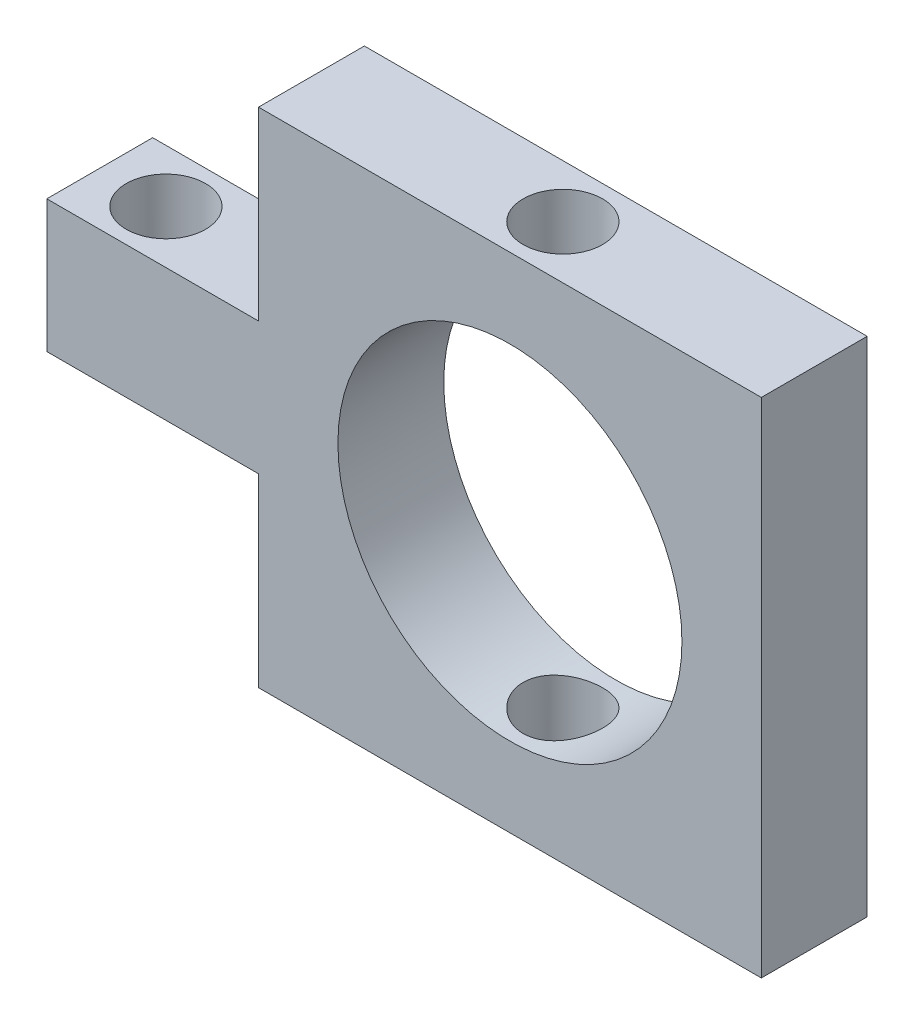
ISO-10303-21;
HEADER;
FILE_DESCRIPTION(('STEP AP214'),'2;1');
FILE_NAME('part.step','',(''),(''),'','','');
FILE_SCHEMA(('AUTOMOTIVE_DESIGN { 1 0 10303 214 1 1 1 1 }'));
ENDSEC;
DATA;
#1=APPLICATION_CONTEXT('core data for automotive mechanical design processes');
#2=APPLICATION_PROTOCOL_DEFINITION('international standard','automotive_design',2000,#1);
#3=PRODUCT_CONTEXT('',#1,'mechanical');
#4=PRODUCT('Part','Part','',(#3));
#5=PRODUCT_RELATED_PRODUCT_CATEGORY('part','',(#4));
#6=PRODUCT_DEFINITION_FORMATION('','',#4);
#7=PRODUCT_DEFINITION_CONTEXT('part definition',#1,'design');
#8=PRODUCT_DEFINITION('design','',#6,#7);
#9=PRODUCT_DEFINITION_SHAPE('','',#8);
#10=(LENGTH_UNIT() NAMED_UNIT(*) SI_UNIT(.MILLI.,.METRE.));
#11=(NAMED_UNIT(*) PLANE_ANGLE_UNIT() SI_UNIT($,.RADIAN.));
#12=(NAMED_UNIT(*) SI_UNIT($,.STERADIAN.) SOLID_ANGLE_UNIT());
#13=UNCERTAINTY_MEASURE_WITH_UNIT(LENGTH_MEASURE(1.E-05),#10,'distance_accuracy_value','');
#14=(GEOMETRIC_REPRESENTATION_CONTEXT(3) GLOBAL_UNCERTAINTY_ASSIGNED_CONTEXT((#13)) GLOBAL_UNIT_ASSIGNED_CONTEXT((#10,
#11,#12)) REPRESENTATION_CONTEXT('',''));
#15=CARTESIAN_POINT('',(0.,0.,0.));
#16=DIRECTION('',(0.,0.,1.));
#17=DIRECTION('',(1.,0.,0.));
#18=AXIS2_PLACEMENT_3D('',#15,#16,#17);
#19=CARTESIAN_POINT('',(-9.5,-9.5,4.));
#20=DIRECTION('',(1.,0.,0.));
#21=DIRECTION('',(0.,0.,-1.));
#22=AXIS2_PLACEMENT_3D('',#19,#20,#21);
#23=PLANE('',#22);
#24=DIRECTION('',(0.,0.,-1.));
#25=VECTOR('',#24,1.);
#26=CARTESIAN_POINT('',(-9.5,2.5,0.));
#27=LINE('',#26,#25);
#28=CARTESIAN_POINT('',(-9.5,2.5,4.));
#29=VERTEX_POINT('',#28);
#30=CARTESIAN_POINT('',(-9.5,2.5,0.));
#31=VERTEX_POINT('',#30);
#32=EDGE_CURVE('E60',#29,#31,#27,.T.);
#33=ORIENTED_EDGE('',*,*,#32,.F.);
#34=DIRECTION('',(0.,-1.,0.));
#35=VECTOR('',#34,1.);
#36=CARTESIAN_POINT('',(-9.5,-9.5,4.));
#37=LINE('',#36,#35);
#38=CARTESIAN_POINT('',(-9.5,9.5,4.));
#39=VERTEX_POINT('',#38);
#40=EDGE_CURVE('E217',#39,#29,#37,.T.);
#41=ORIENTED_EDGE('',*,*,#40,.F.);
#42=DIRECTION('',(0.,0.,-1.));
#43=VECTOR('',#42,1.);
#44=CARTESIAN_POINT('',(-9.5,9.5,4.));
#45=LINE('',#44,#43);
#46=CARTESIAN_POINT('',(-9.5,9.5,0.));
#47=VERTEX_POINT('',#46);
#48=EDGE_CURVE('E53',#39,#47,#45,.T.);
#49=ORIENTED_EDGE('',*,*,#48,.T.);
#50=DIRECTION('',(0.,-1.,0.));
#51=VECTOR('',#50,1.);
#52=CARTESIAN_POINT('',(-9.5,-9.5,0.));
#53=LINE('',#52,#51);
#54=EDGE_CURVE('E216',#47,#31,#53,.T.);
#55=ORIENTED_EDGE('',*,*,#54,.T.);
#56=EDGE_LOOP('',(#33,#41,#49,#55));
#57=FACE_BOUND('',#56,.T.);
#58=ADVANCED_FACE('F44',(#57),#23,.F.);
#59=DIRECTION('',(0.,0.,1.));
#60=VECTOR('',#59,1.);
#61=CARTESIAN_POINT('',(-9.5,-2.5,0.));
#62=LINE('',#61,#60);
#63=CARTESIAN_POINT('',(-9.5,-2.5,0.));
#64=VERTEX_POINT('',#63);
#65=CARTESIAN_POINT('',(-9.5,-2.5,4.));
#66=VERTEX_POINT('',#65);
#67=EDGE_CURVE('E68',#64,#66,#62,.T.);
#68=ORIENTED_EDGE('',*,*,#67,.F.);
#69=CARTESIAN_POINT('',(-9.5,-9.5,0.));
#70=VERTEX_POINT('',#69);
#71=EDGE_CURVE('E137',#64,#70,#53,.T.);
#72=ORIENTED_EDGE('',*,*,#71,.T.);
#73=DIRECTION('',(0.,0.,-1.));
#74=VECTOR('',#73,1.);
#75=CARTESIAN_POINT('',(-9.5,-9.5,4.));
#76=LINE('',#75,#74);
#77=CARTESIAN_POINT('',(-9.5,-9.5,4.));
#78=VERTEX_POINT('',#77);
#79=EDGE_CURVE('E219',#78,#70,#76,.T.);
#80=ORIENTED_EDGE('',*,*,#79,.F.);
#81=EDGE_CURVE('E252',#66,#78,#37,.T.);
#82=ORIENTED_EDGE('',*,*,#81,.F.);
#83=EDGE_LOOP('',(#68,#72,#80,#82));
#84=FACE_BOUND('',#83,.T.);
#85=ADVANCED_FACE('F183',(#84),#23,.F.);
#86=CARTESIAN_POINT('',(0.,0.,4.));
#87=DIRECTION('',(0.,0.,-1.));
#88=DIRECTION('',(-1.,0.,0.));
#89=AXIS2_PLACEMENT_3D('',#86,#87,#88);
#90=CYLINDRICAL_SURFACE('',#89,6.5);
#91=CARTESIAN_POINT('',(0.,-6.5,3.5));
#92=CARTESIAN_POINT('',(-0.0830761724763343,-6.49999849532867,3.49999733464411));
#93=CARTESIAN_POINT('',(-0.166183602986827,-6.49839124214547,3.49307507318891));
#94=CARTESIAN_POINT('',(-0.330029933246627,-6.49213500375529,3.46560235711435));
#95=CARTESIAN_POINT('',(-0.410767233683362,-6.48748401185166,3.4450429115586));
#96=CARTESIAN_POINT('',(-0.567482400649439,-6.47565710646771,3.39098030105908));
#97=CARTESIAN_POINT('',(-0.643465410431957,-6.46848397910972,3.35749141486865));
#98=CARTESIAN_POINT('',(-0.788732955280501,-6.45238316831829,3.27856773493164));
#99=CARTESIAN_POINT('',(-0.858017512835939,-6.44345549077589,3.23313298129406));
#100=CARTESIAN_POINT('',(-0.989152353123209,-6.42464323305021,3.13075474832276));
#101=CARTESIAN_POINT('',(-1.05086679216121,-6.41474568654138,3.07363963829749));
#102=CARTESIAN_POINT('',(-1.16393060397695,-6.39519859507266,2.94989007342867));
#103=CARTESIAN_POINT('',(-1.2152789664991,-6.38554907436474,2.88325469183953));
#104=CARTESIAN_POINT('',(-1.3067669575256,-6.36746174180576,2.74133307243966));
#105=CARTESIAN_POINT('',(-1.34675925477788,-6.35904049089481,2.66594955902318));
#106=CARTESIAN_POINT('',(-1.41345395330062,-6.34455046029963,2.50930490134944));
#107=CARTESIAN_POINT('',(-1.44015813854149,-6.33848136485541,2.4280445477549));
#108=CARTESIAN_POINT('',(-1.4790642425856,-6.32951534623235,2.26343419841731));
#109=CARTESIAN_POINT('',(-1.49150809496879,-6.32656557105072,2.1801443266252));
#110=CARTESIAN_POINT('',(-1.50229307046533,-6.32401364937952,2.01261091295437));
#111=CARTESIAN_POINT('',(-1.50063613156308,-6.32441104286173,1.92836750371725));
#112=CARTESIAN_POINT('',(-1.48346063285703,-6.32846083321139,1.7631371921762));
#113=CARTESIAN_POINT('',(-1.46822575315178,-6.33204661249556,1.68211891865606));
#114=CARTESIAN_POINT('',(-1.42477741479348,-6.34196351386388,1.52382020809838));
#115=CARTESIAN_POINT('',(-1.39656315462671,-6.34829480548987,1.44654000222292));
#116=CARTESIAN_POINT('',(-1.32770349075046,-6.36305332227188,1.29712732835907));
#117=CARTESIAN_POINT('',(-1.28695129246528,-6.37149843240945,1.22504591908903));
#118=CARTESIAN_POINT('',(-1.19424748975256,-6.38952239681953,1.08864076371062));
#119=CARTESIAN_POINT('',(-1.1422941964553,-6.39910142196225,1.02431818974098));
#120=CARTESIAN_POINT('',(-1.02717321086453,-6.41859777640793,0.903626049949029));
#121=CARTESIAN_POINT('',(-0.963764950845054,-6.42851768847713,0.847486114875038));
#122=CARTESIAN_POINT('',(-0.828318641053405,-6.44736816069401,0.746596929024645));
#123=CARTESIAN_POINT('',(-0.75628039874503,-6.45629869876005,0.701847932451417));
#124=CARTESIAN_POINT('',(-0.605321277972371,-6.47219854082994,0.624944085856686));
#125=CARTESIAN_POINT('',(-0.526383143294248,-6.47916273202417,0.592821984307336));
#126=CARTESIAN_POINT('',(-0.364032396252583,-6.49030757986402,0.54236385630495));
#127=CARTESIAN_POINT('',(-0.280620512374237,-6.49448868821629,0.52402559261153));
#128=CARTESIAN_POINT('',(-0.11365732393164,-6.49953102945198,0.501995849651856));
#129=CARTESIAN_POINT('',(-0.0301494450127288,-6.50046326526885,0.497991063940268));
#130=CARTESIAN_POINT('',(0.136342371579224,-6.49910299913129,0.503889014759284));
#131=CARTESIAN_POINT('',(0.219326348562745,-6.49681074208307,0.513790695067997));
#132=CARTESIAN_POINT('',(0.381357903798024,-6.48930412349636,0.546961196605768));
#133=CARTESIAN_POINT('',(0.4604414648757,-6.48412623941868,0.570063241317144));
#134=CARTESIAN_POINT('',(0.613609622481664,-6.47142910428788,0.628791588924371));
#135=CARTESIAN_POINT('',(0.687693760726587,-6.4639096389422,0.664419038135849));
#136=CARTESIAN_POINT('',(0.830037615110187,-6.44718996088191,0.747822643920984));
#137=CARTESIAN_POINT('',(0.898188410296326,-6.43796535296184,0.795779691885197));
#138=CARTESIAN_POINT('',(1.02558718048179,-6.41890391913982,0.90224561735856));
#139=CARTESIAN_POINT('',(1.08483385664762,-6.40906700421673,0.960756031541563));
#140=CARTESIAN_POINT('',(1.19400102833017,-6.38964047483402,1.08811238587903));
#141=CARTESIAN_POINT('',(1.24370343589042,-6.3800601750374,1.1571469646774));
#142=CARTESIAN_POINT('',(1.33081235446409,-6.36246188496285,1.30276588021528));
#143=CARTESIAN_POINT('',(1.3682194122462,-6.35444382521927,1.37934988103845));
#144=CARTESIAN_POINT('',(1.42941066868129,-6.34095951164845,1.53747598842252));
#145=CARTESIAN_POINT('',(1.45327404481083,-6.33547846174878,1.61898612968344));
#146=CARTESIAN_POINT('',(1.48692530676327,-6.3276660054956,1.78500399284777));
#147=CARTESIAN_POINT('',(1.49671574099563,-6.32533402889437,1.86951116919002));
#148=CARTESIAN_POINT('',(1.50182536015786,-6.32412253425542,2.03691822705262));
#149=CARTESIAN_POINT('',(1.49749127871471,-6.32516029248235,2.11980711064856));
#150=CARTESIAN_POINT('',(1.47525685980881,-6.33038270361014,2.28363867866818));
#151=CARTESIAN_POINT('',(1.45735672124418,-6.33456731037362,2.36458139160761));
#152=CARTESIAN_POINT('',(1.40867420720143,-6.34556939165105,2.52190991079113));
#153=CARTESIAN_POINT('',(1.37794771033572,-6.35237543592818,2.59831386070586));
#154=CARTESIAN_POINT('',(1.304530822271,-6.36785683112449,2.74493180654133));
#155=CARTESIAN_POINT('',(1.26183902581514,-6.37653240158127,2.81514507412735));
#156=CARTESIAN_POINT('',(1.16457679516263,-6.39501829374307,2.94908552859008));
#157=CARTESIAN_POINT('',(1.10976162033287,-6.4048496868242,3.01263211954958));
#158=CARTESIAN_POINT('',(0.990297714593211,-6.42440402438128,3.1297382476383));
#159=CARTESIAN_POINT('',(0.92564669602438,-6.43412694306169,3.18329545493028));
#160=CARTESIAN_POINT('',(0.787191932761555,-6.45253999299533,3.27966726794881));
#161=CARTESIAN_POINT('',(0.713266869084888,-6.46121270567525,3.32231111828978));
#162=CARTESIAN_POINT('',(0.559109641475369,-6.47637045552876,3.39449914940861));
#163=CARTESIAN_POINT('',(0.478882547101935,-6.48285722936411,3.42405373510293));
#164=CARTESIAN_POINT('',(0.332210374198768,-6.49182723396727,3.46427847355574));
#165=CARTESIAN_POINT('',(0.266526367321009,-6.49487228966801,3.477647271027));
#166=CARTESIAN_POINT('',(0.133901630280836,-6.4989592245111,3.49550886661472));
#167=CARTESIAN_POINT('',(0.066960968789831,-6.5000012127936,3.50000214832734));
#168=CARTESIAN_POINT('',(0.,-6.5,3.5));
#169=B_SPLINE_CURVE_WITH_KNOTS('',3,(#91,#92,#93,#94,#95,#96,#97,#98,#99,#100,#101,#102,#103,
#104,#105,#106,#107,#108,#109,#110,#111,#112,#113,#114,#115,#116,#117,#118,#119,#120,#121,#122,
#123,#124,#125,#126,#127,#128,#129,#130,#131,#132,#133,#134,#135,#136,#137,#138,#139,#140,#141,
#142,#143,#144,#145,#146,#147,#148,#149,#150,#151,#152,#153,#154,#155,#156,#157,#158,#159,#160,
#161,#162,#163,#164,#165,#166,#167,#168),.UNSPECIFIED.,.T.,.F.,(4,2,2,2,2,2,2,2,2,2,2,2,2,2,2,2,
2,2,2,2,2,2,2,2,2,2,2,2,2,2,2,2,2,2,2,2,2,2,4),(0.,0.248983311217114,0.498130939431098,
0.747004202472747,0.995876629917202,1.24870930222222,1.50156660317464,1.75756840109411,
2.0135358206962,2.26509316141456,2.51661592915602,2.76300377758328,3.00940684320484,
3.25796969712265,3.50657005489342,3.7611752627951,4.01578615203542,4.27105309773002,
4.52627860236006,4.77589001432915,5.02548246887371,5.27198911757477,5.51851833225481,
5.76889433751052,6.01930682944867,6.27489540554877,6.53047261420161,6.7845398863154,
7.03856114466416,7.28639401438666,7.53422325058917,7.7809838930653,8.02777352833801,
8.28009323709706,8.53247172133002,8.78858609727296,9.04449651578221,9.24519271684375,
9.44587798236134),.UNSPECIFIED.);
#170=CARTESIAN_POINT('',(0.,-6.5,3.5));
#171=VERTEX_POINT('',#170);
#172=EDGE_CURVE('E150',#171,#171,#169,.T.);
#173=ORIENTED_EDGE('',*,*,#172,.T.);
#174=EDGE_LOOP('',(#173));
#175=FACE_BOUND('',#174,.T.);
#176=CARTESIAN_POINT('',(0.,0.,0.));
#177=DIRECTION('',(0.,0.,1.));
#178=DIRECTION('',(1.,0.,0.));
#179=AXIS2_PLACEMENT_3D('',#176,#177,#178);
#180=CIRCLE('',#179,6.5);
#181=CARTESIAN_POINT('',(6.5,0.,0.));
#182=VERTEX_POINT('',#181);
#183=EDGE_CURVE('E245',#182,#182,#180,.T.);
#184=ORIENTED_EDGE('',*,*,#183,.F.);
#185=EDGE_LOOP('',(#184));
#186=FACE_BOUND('',#185,.T.);
#187=CARTESIAN_POINT('',(0.,0.,4.));
#188=DIRECTION('',(0.,0.,1.));
#189=DIRECTION('',(1.,0.,0.));
#190=AXIS2_PLACEMENT_3D('',#187,#188,#189);
#191=CIRCLE('',#190,6.5);
#192=CARTESIAN_POINT('',(6.5,0.,4.));
#193=VERTEX_POINT('',#192);
#194=EDGE_CURVE('E242',#193,#193,#191,.T.);
#195=ORIENTED_EDGE('',*,*,#194,.T.);
#196=EDGE_LOOP('',(#195));
#197=FACE_BOUND('',#196,.T.);
#198=CARTESIAN_POINT('',(0.,6.5,0.500000000000002));
#199=CARTESIAN_POINT('',(0.0830761724763343,6.49999849532867,0.500002665355893));
#200=CARTESIAN_POINT('',(0.166183602986827,6.49839124214547,0.506924926811095));
#201=CARTESIAN_POINT('',(0.330029933246627,6.49213500375529,0.534397642885652));
#202=CARTESIAN_POINT('',(0.410767233683362,6.48748401185166,0.554957088441403));
#203=CARTESIAN_POINT('',(0.567482400649438,6.47565710646771,0.609019698940927));
#204=CARTESIAN_POINT('',(0.643465410431956,6.46848397910972,0.642508585131351));
#205=CARTESIAN_POINT('',(0.788732955280501,6.45238316831829,0.721432265068363));
#206=CARTESIAN_POINT('',(0.858017512835939,6.44345549077589,0.76686701870594));
#207=CARTESIAN_POINT('',(0.989152353123209,6.42464323305021,0.869245251677243));
#208=CARTESIAN_POINT('',(1.05086679216121,6.41474568654138,0.926360361702509));
#209=CARTESIAN_POINT('',(1.16393060397695,6.39519859507266,1.05010992657133));
#210=CARTESIAN_POINT('',(1.2152789664991,6.38554907436474,1.11674530816047));
#211=CARTESIAN_POINT('',(1.3067669575256,6.36746174180576,1.25866692756034));
#212=CARTESIAN_POINT('',(1.34675925477788,6.35904049089481,1.33405044097683));
#213=CARTESIAN_POINT('',(1.41345395330062,6.34455046029963,1.49069509865057));
#214=CARTESIAN_POINT('',(1.44015813854148,6.33848136485541,1.57195545224511));
#215=CARTESIAN_POINT('',(1.4790642425856,6.32951534623235,1.73656580158269));
#216=CARTESIAN_POINT('',(1.49150809496879,6.32656557105072,1.8198556733748));
#217=CARTESIAN_POINT('',(1.50229307046533,6.32401364937952,1.98738908704564));
#218=CARTESIAN_POINT('',(1.50063613156308,6.32441104286173,2.07163249628275));
#219=CARTESIAN_POINT('',(1.48346063285703,6.32846083321139,2.2368628078238));
#220=CARTESIAN_POINT('',(1.46822575315178,6.33204661249556,2.31788108134394));
#221=CARTESIAN_POINT('',(1.42477741479348,6.34196351386388,2.47617979190162));
#222=CARTESIAN_POINT('',(1.39656315462671,6.34829480548987,2.55345999777708));
#223=CARTESIAN_POINT('',(1.32770349075046,6.36305332227188,2.70287267164094));
#224=CARTESIAN_POINT('',(1.28695129246528,6.37149843240945,2.77495408091098));
#225=CARTESIAN_POINT('',(1.19424748975256,6.38952239681953,2.91135923628938));
#226=CARTESIAN_POINT('',(1.14229419645531,6.39910142196225,2.97568181025902));
#227=CARTESIAN_POINT('',(1.02717321086453,6.41859777640793,3.09637395005097));
#228=CARTESIAN_POINT('',(0.963764950845054,6.42851768847713,3.15251388512497));
#229=CARTESIAN_POINT('',(0.828318641053406,6.44736816069401,3.25340307097536));
#230=CARTESIAN_POINT('',(0.75628039874503,6.45629869876005,3.29815206754859));
#231=CARTESIAN_POINT('',(0.605321277972371,6.47219854082994,3.37505591414332));
#232=CARTESIAN_POINT('',(0.526383143294249,6.47916273202417,3.40717801569267));
#233=CARTESIAN_POINT('',(0.364032396252583,6.49030757986402,3.45763614369505));
#234=CARTESIAN_POINT('',(0.280620512374238,6.49448868821629,3.47597440738847));
#235=CARTESIAN_POINT('',(0.113657323931641,6.49953102945198,3.49800415034815));
#236=CARTESIAN_POINT('',(0.0301494450127296,6.50046326526885,3.50200893605974));
#237=CARTESIAN_POINT('',(-0.136342371579223,6.49910299913129,3.49611098524072));
#238=CARTESIAN_POINT('',(-0.219326348562745,6.49681074208307,3.48620930493201));
#239=CARTESIAN_POINT('',(-0.381357903798023,6.48930412349636,3.45303880339424));
#240=CARTESIAN_POINT('',(-0.460441464875699,6.48412623941868,3.42993675868286));
#241=CARTESIAN_POINT('',(-0.613609622481663,6.47142910428788,3.37120841107563));
#242=CARTESIAN_POINT('',(-0.687693760726586,6.4639096389422,3.33558096186416));
#243=CARTESIAN_POINT('',(-0.830037615110186,6.44718996088191,3.25217735607902));
#244=CARTESIAN_POINT('',(-0.898188410296325,6.43796535296184,3.20422030811481));
#245=CARTESIAN_POINT('',(-1.02558718048178,6.41890391913982,3.09775438264144));
#246=CARTESIAN_POINT('',(-1.08483385664762,6.40906700421673,3.03924396845844));
#247=CARTESIAN_POINT('',(-1.19400102833017,6.38964047483402,2.91188761412098));
#248=CARTESIAN_POINT('',(-1.24370343589042,6.3800601750374,2.8428530353226));
#249=CARTESIAN_POINT('',(-1.33081235446409,6.36246188496285,2.69723411978472));
#250=CARTESIAN_POINT('',(-1.3682194122462,6.35444382521927,2.62065011896155));
#251=CARTESIAN_POINT('',(-1.42941066868129,6.34095951164845,2.46252401157748));
#252=CARTESIAN_POINT('',(-1.45327404481082,6.33547846174878,2.38101387031657));
#253=CARTESIAN_POINT('',(-1.48692530676327,6.3276660054956,2.21499600715224));
#254=CARTESIAN_POINT('',(-1.49671574099563,6.32533402889437,2.13048883080998));
#255=CARTESIAN_POINT('',(-1.50182536015786,6.32412253425542,1.96308177294738));
#256=CARTESIAN_POINT('',(-1.49749127871471,6.32516029248235,1.88019288935144));
#257=CARTESIAN_POINT('',(-1.47525685980881,6.33038270361014,1.71636132133182));
#258=CARTESIAN_POINT('',(-1.45735672124419,6.33456731037362,1.63541860839239));
#259=CARTESIAN_POINT('',(-1.40867420720143,6.34556939165105,1.47809008920888));
#260=CARTESIAN_POINT('',(-1.37794771033572,6.35237543592818,1.40168613929415));
#261=CARTESIAN_POINT('',(-1.304530822271,6.36785683112448,1.25506819345867));
#262=CARTESIAN_POINT('',(-1.26183902581514,6.37653240158127,1.18485492587265));
#263=CARTESIAN_POINT('',(-1.16457679516263,6.39501829374307,1.05091447140992));
#264=CARTESIAN_POINT('',(-1.10976162033288,6.4048496868242,0.987367880450422));
#265=CARTESIAN_POINT('',(-0.990297714593213,6.42440402438128,0.87026175236171));
#266=CARTESIAN_POINT('',(-0.925646696024382,6.43412694306169,0.816704545069724));
#267=CARTESIAN_POINT('',(-0.787191932761555,6.45253999299533,0.72033273205119));
#268=CARTESIAN_POINT('',(-0.713266869084888,6.46121270567525,0.677688881710227));
#269=CARTESIAN_POINT('',(-0.559109641475369,6.47637045552876,0.605500850591392));
#270=CARTESIAN_POINT('',(-0.478882547101936,6.48285722936411,0.575946264897073));
#271=CARTESIAN_POINT('',(-0.332210374198769,6.49182723396727,0.535721526444267));
#272=CARTESIAN_POINT('',(-0.26652636732101,6.49487228966801,0.522352728972999));
#273=CARTESIAN_POINT('',(-0.133901630280836,6.4989592245111,0.504491133385284));
#274=CARTESIAN_POINT('',(-0.0669609687898309,6.5000012127936,0.499997851672661));
#275=CARTESIAN_POINT('',(0.,6.5,0.500000000000002));
#276=B_SPLINE_CURVE_WITH_KNOTS('',3,(#198,#199,#200,#201,#202,#203,#204,#205,#206,#207,#208,
#209,#210,#211,#212,#213,#214,#215,#216,#217,#218,#219,#220,#221,#222,#223,#224,#225,#226,#227,
#228,#229,#230,#231,#232,#233,#234,#235,#236,#237,#238,#239,#240,#241,#242,#243,#244,#245,#246,
#247,#248,#249,#250,#251,#252,#253,#254,#255,#256,#257,#258,#259,#260,#261,#262,#263,#264,#265,
#266,#267,#268,#269,#270,#271,#272,#273,#274,#275),.UNSPECIFIED.,.T.,.F.,(4,2,2,2,2,2,2,2,2,2,2,
2,2,2,2,2,2,2,2,2,2,2,2,2,2,2,2,2,2,2,2,2,2,2,2,2,2,2,4),(0.,0.248983311217114,
0.498130939431098,0.747004202472746,0.995876629917201,1.24870930222222,1.50156660317464,
1.75756840109411,2.0135358206962,2.26509316141456,2.51661592915602,2.76300377758328,
3.00940684320484,3.25796969712265,3.50657005489342,3.7611752627951,4.01578615203542,
4.27105309773002,4.52627860236006,4.77589001432915,5.02548246887371,5.27198911757477,
5.51851833225481,5.76889433751052,6.01930682944867,6.27489540554877,6.53047261420161,
6.7845398863154,7.03856114466417,7.28639401438666,7.53422325058917,7.7809838930653,
8.02777352833801,8.28009323709706,8.53247172133002,8.78858609727296,9.04449651578221,
9.24519271684376,9.44587798236134),.UNSPECIFIED.);
#277=CARTESIAN_POINT('',(0.,6.5,0.500000000000002));
#278=VERTEX_POINT('',#277);
#279=EDGE_CURVE('E139',#278,#278,#276,.T.);
#280=ORIENTED_EDGE('',*,*,#279,.F.);
#281=EDGE_LOOP('',(#280));
#282=FACE_BOUND('',#281,.T.);
#283=ADVANCED_FACE('F189',(#175,#186,#197,#282),#90,.F.);
#284=CARTESIAN_POINT('',(0.,0.,4.));
#285=DIRECTION('',(0.,0.,-1.));
#286=DIRECTION('',(-1.,0.,0.));
#287=AXIS2_PLACEMENT_3D('',#284,#285,#286);
#288=PLANE('',#287);
#289=DIRECTION('',(0.,1.,0.));
#290=VECTOR('',#289,1.);
#291=CARTESIAN_POINT('',(9.5,-9.5,4.));
#292=LINE('',#291,#290);
#293=CARTESIAN_POINT('',(9.5,-9.5,4.));
#294=VERTEX_POINT('',#293);
#295=CARTESIAN_POINT('',(9.5,9.5,4.));
#296=VERTEX_POINT('',#295);
#297=EDGE_CURVE('E226',#294,#296,#292,.T.);
#298=ORIENTED_EDGE('',*,*,#297,.T.);
#299=DIRECTION('',(-1.,0.,0.));
#300=VECTOR('',#299,1.);
#301=CARTESIAN_POINT('',(-9.5,9.5,4.));
#302=LINE('',#301,#300);
#303=EDGE_CURVE('E253',#296,#39,#302,.T.);
#304=ORIENTED_EDGE('',*,*,#303,.T.);
#305=ORIENTED_EDGE('',*,*,#40,.T.);
#306=DIRECTION('',(1.,0.,0.));
#307=VECTOR('',#306,1.);
#308=CARTESIAN_POINT('',(-17.5,2.5,4.));
#309=LINE('',#308,#307);
#310=CARTESIAN_POINT('',(-17.5,2.5,4.));
#311=VERTEX_POINT('',#310);
#312=EDGE_CURVE('E146',#311,#29,#309,.T.);
#313=ORIENTED_EDGE('',*,*,#312,.F.);
#314=DIRECTION('',(0.,1.,0.));
#315=VECTOR('',#314,1.);
#316=CARTESIAN_POINT('',(-17.5,-2.5,4.));
#317=LINE('',#316,#315);
#318=CARTESIAN_POINT('',(-17.5,-2.5,4.));
#319=VERTEX_POINT('',#318);
#320=EDGE_CURVE('E121',#319,#311,#317,.T.);
#321=ORIENTED_EDGE('',*,*,#320,.F.);
#322=DIRECTION('',(1.,0.,0.));
#323=VECTOR('',#322,1.);
#324=CARTESIAN_POINT('',(-17.5,-2.5,4.));
#325=LINE('',#324,#323);
#326=EDGE_CURVE('E117',#319,#66,#325,.T.);
#327=ORIENTED_EDGE('',*,*,#326,.T.);
#328=ORIENTED_EDGE('',*,*,#81,.T.);
#329=DIRECTION('',(1.,0.,0.));
#330=VECTOR('',#329,1.);
#331=CARTESIAN_POINT('',(-9.5,-9.5,4.));
#332=LINE('',#331,#330);
#333=EDGE_CURVE('E234',#78,#294,#332,.T.);
#334=ORIENTED_EDGE('',*,*,#333,.T.);
#335=EDGE_LOOP('',(#298,#304,#305,#313,#321,#327,#328,#334));
#336=FACE_BOUND('',#335,.T.);
#337=ORIENTED_EDGE('',*,*,#194,.F.);
#338=EDGE_LOOP('',(#337));
#339=FACE_BOUND('',#338,.T.);
#340=ADVANCED_FACE('F269',(#336,#339),#288,.F.);
#341=CARTESIAN_POINT('',(0.,0.,0.));
#342=DIRECTION('',(0.,0.,-1.));
#343=DIRECTION('',(-1.,0.,0.));
#344=AXIS2_PLACEMENT_3D('',#341,#342,#343);
#345=PLANE('',#344);
#346=DIRECTION('',(0.,1.,0.));
#347=VECTOR('',#346,1.);
#348=CARTESIAN_POINT('',(9.5,-9.5,0.));
#349=LINE('',#348,#347);
#350=CARTESIAN_POINT('',(9.5,-9.5,0.));
#351=VERTEX_POINT('',#350);
#352=CARTESIAN_POINT('',(9.5,9.5,0.));
#353=VERTEX_POINT('',#352);
#354=EDGE_CURVE('E214',#351,#353,#349,.T.);
#355=ORIENTED_EDGE('',*,*,#354,.F.);
#356=DIRECTION('',(1.,0.,0.));
#357=VECTOR('',#356,1.);
#358=CARTESIAN_POINT('',(-9.5,-9.5,0.));
#359=LINE('',#358,#357);
#360=EDGE_CURVE('E222',#70,#351,#359,.T.);
#361=ORIENTED_EDGE('',*,*,#360,.F.);
#362=ORIENTED_EDGE('',*,*,#71,.F.);
#363=DIRECTION('',(1.,0.,0.));
#364=VECTOR('',#363,1.);
#365=CARTESIAN_POINT('',(-17.5,-2.5,0.));
#366=LINE('',#365,#364);
#367=CARTESIAN_POINT('',(-17.5,-2.5,0.));
#368=VERTEX_POINT('',#367);
#369=EDGE_CURVE('E115',#368,#64,#366,.T.);
#370=ORIENTED_EDGE('',*,*,#369,.F.);
#371=DIRECTION('',(0.,-1.,0.));
#372=VECTOR('',#371,1.);
#373=CARTESIAN_POINT('',(-17.5,-2.5,0.));
#374=LINE('',#373,#372);
#375=CARTESIAN_POINT('',(-17.5,2.5,0.));
#376=VERTEX_POINT('',#375);
#377=EDGE_CURVE('E122',#376,#368,#374,.T.);
#378=ORIENTED_EDGE('',*,*,#377,.F.);
#379=DIRECTION('',(1.,0.,0.));
#380=VECTOR('',#379,1.);
#381=CARTESIAN_POINT('',(-17.5,2.5,0.));
#382=LINE('',#381,#380);
#383=EDGE_CURVE('E220',#376,#31,#382,.T.);
#384=ORIENTED_EDGE('',*,*,#383,.T.);
#385=ORIENTED_EDGE('',*,*,#54,.F.);
#386=DIRECTION('',(-1.,0.,0.));
#387=VECTOR('',#386,1.);
#388=CARTESIAN_POINT('',(-9.5,9.5,0.));
#389=LINE('',#388,#387);
#390=EDGE_CURVE('E208',#353,#47,#389,.T.);
#391=ORIENTED_EDGE('',*,*,#390,.F.);
#392=EDGE_LOOP('',(#355,#361,#362,#370,#378,#384,#385,#391));
#393=FACE_BOUND('',#392,.T.);
#394=ORIENTED_EDGE('',*,*,#183,.T.);
#395=EDGE_LOOP('',(#394));
#396=FACE_BOUND('',#395,.T.);
#397=ADVANCED_FACE('F134',(#393,#396),#345,.T.);
#398=CARTESIAN_POINT('',(9.5,-9.5,4.));
#399=DIRECTION('',(-1.,0.,0.));
#400=DIRECTION('',(0.,0.,1.));
#401=AXIS2_PLACEMENT_3D('',#398,#399,#400);
#402=PLANE('',#401);
#403=ORIENTED_EDGE('',*,*,#354,.T.);
#404=DIRECTION('',(0.,0.,-1.));
#405=VECTOR('',#404,1.);
#406=CARTESIAN_POINT('',(9.5,9.5,4.));
#407=LINE('',#406,#405);
#408=EDGE_CURVE('E11',#296,#353,#407,.T.);
#409=ORIENTED_EDGE('',*,*,#408,.F.);
#410=ORIENTED_EDGE('',*,*,#297,.F.);
#411=DIRECTION('',(0.,0.,-1.));
#412=VECTOR('',#411,1.);
#413=CARTESIAN_POINT('',(9.5,-9.5,4.));
#414=LINE('',#413,#412);
#415=EDGE_CURVE('E230',#294,#351,#414,.T.);
#416=ORIENTED_EDGE('',*,*,#415,.T.);
#417=EDGE_LOOP('',(#403,#409,#410,#416));
#418=FACE_BOUND('',#417,.T.);
#419=ADVANCED_FACE('F46',(#418),#402,.F.);
#420=CARTESIAN_POINT('',(-9.5,9.5,4.));
#421=DIRECTION('',(0.,-1.,0.));
#422=DIRECTION('',(0.,0.,-1.));
#423=AXIS2_PLACEMENT_3D('',#420,#421,#422);
#424=PLANE('',#423);
#425=CARTESIAN_POINT('',(0.,9.5,2.));
#426=DIRECTION('',(0.,-1.,0.));
#427=DIRECTION('',(0.,0.,-1.));
#428=AXIS2_PLACEMENT_3D('',#425,#426,#427);
#429=CIRCLE('',#428,1.5);
#430=CARTESIAN_POINT('',(0.,9.5,0.500000000000002));
#431=VERTEX_POINT('',#430);
#432=EDGE_CURVE('E144',#431,#431,#429,.T.);
#433=ORIENTED_EDGE('',*,*,#432,.T.);
#434=EDGE_LOOP('',(#433));
#435=FACE_BOUND('',#434,.T.);
#436=ORIENTED_EDGE('',*,*,#390,.T.);
#437=ORIENTED_EDGE('',*,*,#48,.F.);
#438=ORIENTED_EDGE('',*,*,#303,.F.);
#439=ORIENTED_EDGE('',*,*,#408,.T.);
#440=EDGE_LOOP('',(#436,#437,#438,#439));
#441=FACE_BOUND('',#440,.T.);
#442=ADVANCED_FACE('F193',(#435,#441),#424,.F.);
#443=CARTESIAN_POINT('',(-9.5,-9.5,4.));
#444=DIRECTION('',(0.,1.,0.));
#445=DIRECTION('',(0.,0.,1.));
#446=AXIS2_PLACEMENT_3D('',#443,#444,#445);
#447=PLANE('',#446);
#448=CARTESIAN_POINT('',(0.,-9.5,2.));
#449=DIRECTION('',(0.,1.,0.));
#450=DIRECTION('',(0.,0.,1.));
#451=AXIS2_PLACEMENT_3D('',#448,#449,#450);
#452=CIRCLE('',#451,1.5);
#453=CARTESIAN_POINT('',(0.,-9.5,3.5));
#454=VERTEX_POINT('',#453);
#455=EDGE_CURVE('E159',#454,#454,#452,.F.);
#456=ORIENTED_EDGE('',*,*,#455,.F.);
#457=EDGE_LOOP('',(#456));
#458=FACE_BOUND('',#457,.T.);
#459=ORIENTED_EDGE('',*,*,#360,.T.);
#460=ORIENTED_EDGE('',*,*,#415,.F.);
#461=ORIENTED_EDGE('',*,*,#333,.F.);
#462=ORIENTED_EDGE('',*,*,#79,.T.);
#463=EDGE_LOOP('',(#459,#460,#461,#462));
#464=FACE_BOUND('',#463,.T.);
#465=ADVANCED_FACE('F191',(#458,#464),#447,.F.);
#466=CARTESIAN_POINT('',(0.,9.501,2.));
#467=DIRECTION('',(0.,-1.,0.));
#468=DIRECTION('',(0.,0.,-1.));
#469=AXIS2_PLACEMENT_3D('',#466,#467,#468);
#470=CYLINDRICAL_SURFACE('',#469,1.5);
#471=ORIENTED_EDGE('',*,*,#279,.T.);
#472=EDGE_LOOP('',(#471));
#473=FACE_BOUND('',#472,.T.);
#474=ORIENTED_EDGE('',*,*,#432,.F.);
#475=EDGE_LOOP('',(#474));
#476=FACE_BOUND('',#475,.T.);
#477=ADVANCED_FACE('F200',(#473,#476),#470,.F.);
#478=CARTESIAN_POINT('',(0.,-9.501,2.));
#479=DIRECTION('',(0.,1.,0.));
#480=DIRECTION('',(0.,0.,1.));
#481=AXIS2_PLACEMENT_3D('',#478,#479,#480);
#482=CYLINDRICAL_SURFACE('',#481,1.5);
#483=ORIENTED_EDGE('',*,*,#172,.F.);
#484=EDGE_LOOP('',(#483));
#485=FACE_BOUND('',#484,.T.);
#486=ORIENTED_EDGE('',*,*,#455,.T.);
#487=EDGE_LOOP('',(#486));
#488=FACE_BOUND('',#487,.T.);
#489=ADVANCED_FACE('F161',(#485,#488),#482,.F.);
#490=CARTESIAN_POINT('',(-17.5,-2.5,0.));
#491=DIRECTION('',(0.,1.,0.));
#492=DIRECTION('',(0.,0.,1.));
#493=AXIS2_PLACEMENT_3D('',#490,#491,#492);
#494=PLANE('',#493);
#495=CARTESIAN_POINT('',(-15.,-2.5,2.));
#496=DIRECTION('',(0.,1.,0.));
#497=DIRECTION('',(0.,0.,1.));
#498=AXIS2_PLACEMENT_3D('',#495,#496,#497);
#499=CIRCLE('',#498,1.5);
#500=CARTESIAN_POINT('',(-15.,-2.5,3.5));
#501=VERTEX_POINT('',#500);
#502=EDGE_CURVE('E384',#501,#501,#499,.F.);
#503=ORIENTED_EDGE('',*,*,#502,.F.);
#504=EDGE_LOOP('',(#503));
#505=FACE_BOUND('',#504,.T.);
#506=ORIENTED_EDGE('',*,*,#67,.T.);
#507=ORIENTED_EDGE('',*,*,#326,.F.);
#508=DIRECTION('',(0.,0.,1.));
#509=VECTOR('',#508,1.);
#510=CARTESIAN_POINT('',(-17.5,-2.5,0.));
#511=LINE('',#510,#509);
#512=EDGE_CURVE('E111',#368,#319,#511,.T.);
#513=ORIENTED_EDGE('',*,*,#512,.F.);
#514=ORIENTED_EDGE('',*,*,#369,.T.);
#515=EDGE_LOOP('',(#506,#507,#513,#514));
#516=FACE_BOUND('',#515,.T.);
#517=ADVANCED_FACE('F113',(#505,#516),#494,.F.);
#518=CARTESIAN_POINT('',(-17.5,2.5,0.));
#519=DIRECTION('',(0.,-1.,0.));
#520=DIRECTION('',(0.,0.,-1.));
#521=AXIS2_PLACEMENT_3D('',#518,#519,#520);
#522=PLANE('',#521);
#523=CARTESIAN_POINT('',(-15.,2.5,2.));
#524=DIRECTION('',(0.,-1.,0.));
#525=DIRECTION('',(0.,0.,-1.));
#526=AXIS2_PLACEMENT_3D('',#523,#524,#525);
#527=CIRCLE('',#526,1.5);
#528=CARTESIAN_POINT('',(-15.,2.5,0.499999999999997));
#529=VERTEX_POINT('',#528);
#530=EDGE_CURVE('E378',#529,#529,#527,.T.);
#531=ORIENTED_EDGE('',*,*,#530,.T.);
#532=EDGE_LOOP('',(#531));
#533=FACE_BOUND('',#532,.T.);
#534=ORIENTED_EDGE('',*,*,#32,.T.);
#535=ORIENTED_EDGE('',*,*,#383,.F.);
#536=DIRECTION('',(0.,0.,-1.));
#537=VECTOR('',#536,1.);
#538=CARTESIAN_POINT('',(-17.5,2.5,0.));
#539=LINE('',#538,#537);
#540=EDGE_CURVE('E127',#311,#376,#539,.T.);
#541=ORIENTED_EDGE('',*,*,#540,.F.);
#542=ORIENTED_EDGE('',*,*,#312,.T.);
#543=EDGE_LOOP('',(#534,#535,#541,#542));
#544=FACE_BOUND('',#543,.T.);
#545=ADVANCED_FACE('F168',(#533,#544),#522,.F.);
#546=CARTESIAN_POINT('',(-17.5,0.,0.));
#547=DIRECTION('',(1.,0.,0.));
#548=DIRECTION('',(0.,0.,-1.));
#549=AXIS2_PLACEMENT_3D('',#546,#547,#548);
#550=PLANE('',#549);
#551=ORIENTED_EDGE('',*,*,#377,.T.);
#552=ORIENTED_EDGE('',*,*,#512,.T.);
#553=ORIENTED_EDGE('',*,*,#320,.T.);
#554=ORIENTED_EDGE('',*,*,#540,.T.);
#555=EDGE_LOOP('',(#551,#552,#553,#554));
#556=FACE_BOUND('',#555,.T.);
#557=ADVANCED_FACE('F125',(#556),#550,.F.);
#558=CARTESIAN_POINT('',(-15.,9.501,2.));
#559=DIRECTION('',(0.,-1.,0.));
#560=DIRECTION('',(0.,0.,-1.));
#561=AXIS2_PLACEMENT_3D('',#558,#559,#560);
#562=CYLINDRICAL_SURFACE('',#561,1.5);
#563=ORIENTED_EDGE('',*,*,#530,.F.);
#564=EDGE_LOOP('',(#563));
#565=FACE_BOUND('',#564,.T.);
#566=ORIENTED_EDGE('',*,*,#502,.T.);
#567=EDGE_LOOP('',(#566));
#568=FACE_BOUND('',#567,.T.);
#569=ADVANCED_FACE('F175',(#565,#568),#562,.F.);
#570=CLOSED_SHELL('',(#58,#85,#283,#340,#397,#419,#442,#465,#477,#489,#517,#545,#557,#569));
#571=MANIFOLD_SOLID_BREP('B2',#570);
#572=ADVANCED_BREP_SHAPE_REPRESENTATION('',(#18,#571),#14);
#573=SHAPE_DEFINITION_REPRESENTATION(#9,#572);
ENDSEC;
END-ISO-10303-21;
